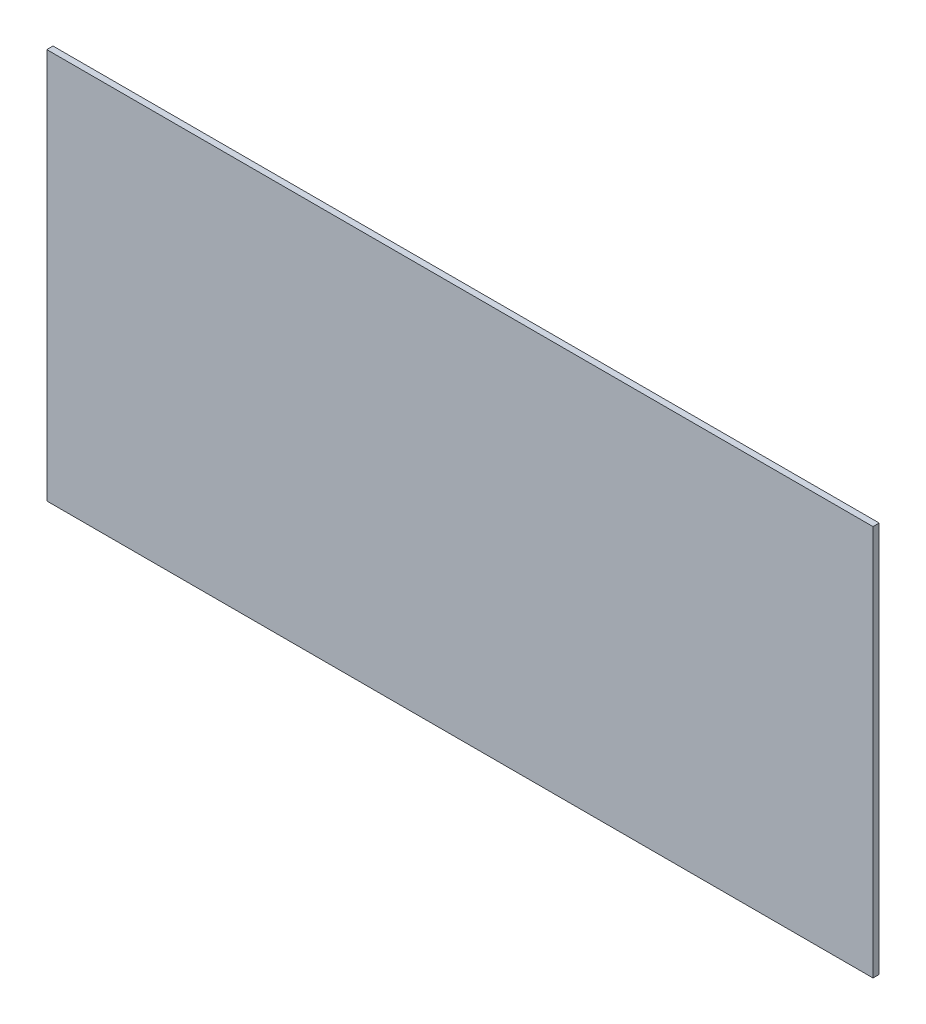
ISO-10303-21;
HEADER;
FILE_DESCRIPTION(('STEP AP214'),'2;1');
FILE_NAME('part.step','',(''),(''),'','','');
FILE_SCHEMA(('AUTOMOTIVE_DESIGN { 1 0 10303 214 1 1 1 1 }'));
ENDSEC;
DATA;
#1=APPLICATION_CONTEXT('core data for automotive mechanical design processes');
#2=APPLICATION_PROTOCOL_DEFINITION('international standard','automotive_design',2000,#1);
#3=PRODUCT_CONTEXT('',#1,'mechanical');
#4=PRODUCT('Part','Part','',(#3));
#5=PRODUCT_RELATED_PRODUCT_CATEGORY('part','',(#4));
#6=PRODUCT_DEFINITION_FORMATION('','',#4);
#7=PRODUCT_DEFINITION_CONTEXT('part definition',#1,'design');
#8=PRODUCT_DEFINITION('design','',#6,#7);
#9=PRODUCT_DEFINITION_SHAPE('','',#8);
#10=(LENGTH_UNIT() NAMED_UNIT(*) SI_UNIT(.MILLI.,.METRE.));
#11=(NAMED_UNIT(*) PLANE_ANGLE_UNIT() SI_UNIT($,.RADIAN.));
#12=(NAMED_UNIT(*) SI_UNIT($,.STERADIAN.) SOLID_ANGLE_UNIT());
#13=UNCERTAINTY_MEASURE_WITH_UNIT(LENGTH_MEASURE(1.E-05),#10,'distance_accuracy_value','');
#14=(GEOMETRIC_REPRESENTATION_CONTEXT(3) GLOBAL_UNCERTAINTY_ASSIGNED_CONTEXT((#13)) GLOBAL_UNIT_ASSIGNED_CONTEXT((#10,
#11,#12)) REPRESENTATION_CONTEXT('',''));
#15=CARTESIAN_POINT('',(0.,0.,0.));
#16=DIRECTION('',(0.,0.,1.));
#17=DIRECTION('',(1.,0.,0.));
#18=AXIS2_PLACEMENT_3D('',#15,#16,#17);
#19=CARTESIAN_POINT('',(-211.35,-100.,3.175));
#20=DIRECTION('',(1.,0.,0.));
#21=DIRECTION('',(0.,0.,-1.));
#22=AXIS2_PLACEMENT_3D('',#19,#20,#21);
#23=PLANE('',#22);
#24=DIRECTION('',(0.,-1.,0.));
#25=VECTOR('',#24,1.);
#26=CARTESIAN_POINT('',(-211.35,-100.,0.));
#27=LINE('',#26,#25);
#28=CARTESIAN_POINT('',(-211.35,100.,0.));
#29=VERTEX_POINT('',#28);
#30=CARTESIAN_POINT('',(-211.35,-100.,0.));
#31=VERTEX_POINT('',#30);
#32=EDGE_CURVE('E95',#29,#31,#27,.T.);
#33=ORIENTED_EDGE('',*,*,#32,.T.);
#34=DIRECTION('',(0.,0.,-1.));
#35=VECTOR('',#34,1.);
#36=CARTESIAN_POINT('',(-211.35,-100.,3.175));
#37=LINE('',#36,#35);
#38=CARTESIAN_POINT('',(-211.35,-100.,3.175));
#39=VERTEX_POINT('',#38);
#40=EDGE_CURVE('E11',#39,#31,#37,.T.);
#41=ORIENTED_EDGE('',*,*,#40,.F.);
#42=DIRECTION('',(0.,-1.,0.));
#43=VECTOR('',#42,1.);
#44=CARTESIAN_POINT('',(-211.35,-100.,3.175));
#45=LINE('',#44,#43);
#46=CARTESIAN_POINT('',(-211.35,100.,3.175));
#47=VERTEX_POINT('',#46);
#48=EDGE_CURVE('E83',#47,#39,#45,.T.);
#49=ORIENTED_EDGE('',*,*,#48,.F.);
#50=DIRECTION('',(0.,0.,-1.));
#51=VECTOR('',#50,1.);
#52=CARTESIAN_POINT('',(-211.35,100.,3.175));
#53=LINE('',#52,#51);
#54=EDGE_CURVE('E91',#47,#29,#53,.T.);
#55=ORIENTED_EDGE('',*,*,#54,.T.);
#56=EDGE_LOOP('',(#33,#41,#49,#55));
#57=FACE_BOUND('',#56,.T.);
#58=ADVANCED_FACE('F32',(#57),#23,.F.);
#59=CARTESIAN_POINT('',(211.35,-100.,3.175));
#60=DIRECTION('',(0.,1.,0.));
#61=DIRECTION('',(-1.,0.,0.));
#62=AXIS2_PLACEMENT_3D('',#59,#60,#61);
#63=PLANE('',#62);
#64=DIRECTION('',(1.,0.,0.));
#65=VECTOR('',#64,1.);
#66=CARTESIAN_POINT('',(211.35,-100.,0.));
#67=LINE('',#66,#65);
#68=CARTESIAN_POINT('',(211.35,-100.,0.));
#69=VERTEX_POINT('',#68);
#70=EDGE_CURVE('E87',#31,#69,#67,.T.);
#71=ORIENTED_EDGE('',*,*,#70,.T.);
#72=DIRECTION('',(0.,0.,-1.));
#73=VECTOR('',#72,1.);
#74=CARTESIAN_POINT('',(211.35,-100.,3.175));
#75=LINE('',#74,#73);
#76=CARTESIAN_POINT('',(211.35,-100.,3.175));
#77=VERTEX_POINT('',#76);
#78=EDGE_CURVE('E40',#77,#69,#75,.T.);
#79=ORIENTED_EDGE('',*,*,#78,.F.);
#80=DIRECTION('',(1.,0.,0.));
#81=VECTOR('',#80,1.);
#82=CARTESIAN_POINT('',(211.35,-100.,3.175));
#83=LINE('',#82,#81);
#84=EDGE_CURVE('E78',#39,#77,#83,.T.);
#85=ORIENTED_EDGE('',*,*,#84,.F.);
#86=ORIENTED_EDGE('',*,*,#40,.T.);
#87=EDGE_LOOP('',(#71,#79,#85,#86));
#88=FACE_BOUND('',#87,.T.);
#89=ADVANCED_FACE('F86',(#88),#63,.F.);
#90=CARTESIAN_POINT('',(211.35,-100.,3.175));
#91=DIRECTION('',(-1.,0.,0.));
#92=DIRECTION('',(0.,0.,1.));
#93=AXIS2_PLACEMENT_3D('',#90,#91,#92);
#94=PLANE('',#93);
#95=DIRECTION('',(0.,1.,0.));
#96=VECTOR('',#95,1.);
#97=CARTESIAN_POINT('',(211.35,-100.,0.));
#98=LINE('',#97,#96);
#99=CARTESIAN_POINT('',(211.35,100.,0.));
#100=VERTEX_POINT('',#99);
#101=EDGE_CURVE('E65',#69,#100,#98,.T.);
#102=ORIENTED_EDGE('',*,*,#101,.T.);
#103=DIRECTION('',(0.,0.,-1.));
#104=VECTOR('',#103,1.);
#105=CARTESIAN_POINT('',(211.35,100.,3.175));
#106=LINE('',#105,#104);
#107=CARTESIAN_POINT('',(211.35,100.,3.175));
#108=VERTEX_POINT('',#107);
#109=EDGE_CURVE('E88',#108,#100,#106,.T.);
#110=ORIENTED_EDGE('',*,*,#109,.F.);
#111=DIRECTION('',(0.,1.,0.));
#112=VECTOR('',#111,1.);
#113=CARTESIAN_POINT('',(211.35,-100.,3.175));
#114=LINE('',#113,#112);
#115=EDGE_CURVE('E81',#77,#108,#114,.T.);
#116=ORIENTED_EDGE('',*,*,#115,.F.);
#117=ORIENTED_EDGE('',*,*,#78,.T.);
#118=EDGE_LOOP('',(#102,#110,#116,#117));
#119=FACE_BOUND('',#118,.T.);
#120=ADVANCED_FACE('F89',(#119),#94,.F.);
#121=CARTESIAN_POINT('',(211.35,100.,3.175));
#122=DIRECTION('',(0.,-1.,0.));
#123=DIRECTION('',(1.,0.,0.));
#124=AXIS2_PLACEMENT_3D('',#121,#122,#123);
#125=PLANE('',#124);
#126=DIRECTION('',(-1.,0.,0.));
#127=VECTOR('',#126,1.);
#128=CARTESIAN_POINT('',(211.35,100.,0.));
#129=LINE('',#128,#127);
#130=EDGE_CURVE('E71',#100,#29,#129,.T.);
#131=ORIENTED_EDGE('',*,*,#130,.T.);
#132=ORIENTED_EDGE('',*,*,#54,.F.);
#133=DIRECTION('',(-1.,0.,0.));
#134=VECTOR('',#133,1.);
#135=CARTESIAN_POINT('',(211.35,100.,3.175));
#136=LINE('',#135,#134);
#137=EDGE_CURVE('E48',#108,#47,#136,.T.);
#138=ORIENTED_EDGE('',*,*,#137,.F.);
#139=ORIENTED_EDGE('',*,*,#109,.T.);
#140=EDGE_LOOP('',(#131,#132,#138,#139));
#141=FACE_BOUND('',#140,.T.);
#142=ADVANCED_FACE('F102',(#141),#125,.F.);
#143=CARTESIAN_POINT('',(0.,0.,3.175));
#144=DIRECTION('',(0.,0.,1.));
#145=DIRECTION('',(1.,0.,0.));
#146=AXIS2_PLACEMENT_3D('',#143,#144,#145);
#147=PLANE('',#146);
#148=ORIENTED_EDGE('',*,*,#48,.T.);
#149=ORIENTED_EDGE('',*,*,#84,.T.);
#150=ORIENTED_EDGE('',*,*,#115,.T.);
#151=ORIENTED_EDGE('',*,*,#137,.T.);
#152=EDGE_LOOP('',(#148,#149,#150,#151));
#153=FACE_BOUND('',#152,.T.);
#154=ADVANCED_FACE('F79',(#153),#147,.T.);
#155=CARTESIAN_POINT('',(0.,0.,0.));
#156=DIRECTION('',(0.,0.,1.));
#157=DIRECTION('',(1.,0.,0.));
#158=AXIS2_PLACEMENT_3D('',#155,#156,#157);
#159=PLANE('',#158);
#160=ORIENTED_EDGE('',*,*,#32,.F.);
#161=ORIENTED_EDGE('',*,*,#130,.F.);
#162=ORIENTED_EDGE('',*,*,#101,.F.);
#163=ORIENTED_EDGE('',*,*,#70,.F.);
#164=EDGE_LOOP('',(#160,#161,#162,#163));
#165=FACE_BOUND('',#164,.T.);
#166=ADVANCED_FACE('F105',(#165),#159,.F.);
#167=CLOSED_SHELL('',(#58,#89,#120,#142,#154,#166));
#168=MANIFOLD_SOLID_BREP('B2',#167);
#169=ADVANCED_BREP_SHAPE_REPRESENTATION('',(#18,#168),#14);
#170=SHAPE_DEFINITION_REPRESENTATION(#9,#169);
ENDSEC;
END-ISO-10303-21;
